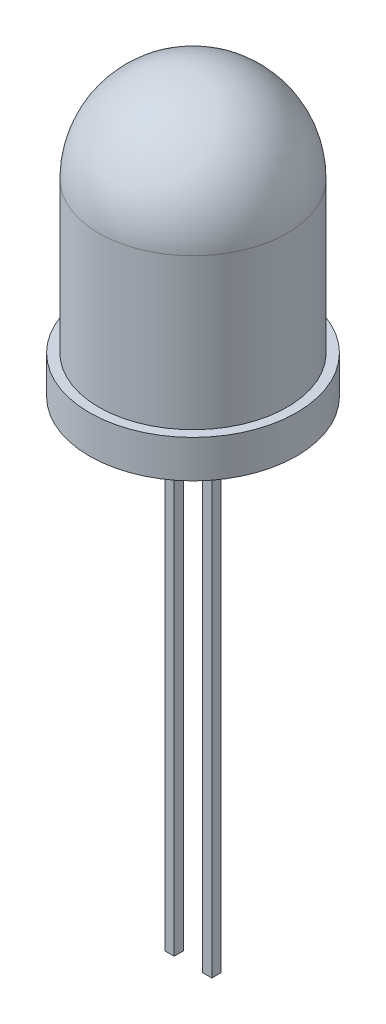
ISO-10303-21;
HEADER;
FILE_DESCRIPTION(('STEP AP214'),'2;1');
FILE_NAME('part.step','',(''),(''),'','','');
FILE_SCHEMA(('AUTOMOTIVE_DESIGN { 1 0 10303 214 1 1 1 1 }'));
ENDSEC;
DATA;
#1=APPLICATION_CONTEXT('core data for automotive mechanical design processes');
#2=APPLICATION_PROTOCOL_DEFINITION('international standard','automotive_design',2000,#1);
#3=PRODUCT_CONTEXT('',#1,'mechanical');
#4=PRODUCT('Part','Part','',(#3));
#5=PRODUCT_RELATED_PRODUCT_CATEGORY('part','',(#4));
#6=PRODUCT_DEFINITION_FORMATION('','',#4);
#7=PRODUCT_DEFINITION_CONTEXT('part definition',#1,'design');
#8=PRODUCT_DEFINITION('design','',#6,#7);
#9=PRODUCT_DEFINITION_SHAPE('','',#8);
#10=(LENGTH_UNIT() NAMED_UNIT(*) SI_UNIT(.MILLI.,.METRE.));
#11=(NAMED_UNIT(*) PLANE_ANGLE_UNIT() SI_UNIT($,.RADIAN.));
#12=(NAMED_UNIT(*) SI_UNIT($,.STERADIAN.) SOLID_ANGLE_UNIT());
#13=UNCERTAINTY_MEASURE_WITH_UNIT(LENGTH_MEASURE(1.E-05),#10,'distance_accuracy_value','');
#14=(GEOMETRIC_REPRESENTATION_CONTEXT(3) GLOBAL_UNCERTAINTY_ASSIGNED_CONTEXT((#13)) GLOBAL_UNIT_ASSIGNED_CONTEXT((#10,
#11,#12)) REPRESENTATION_CONTEXT('',''));
#15=CARTESIAN_POINT('',(0.,0.,0.));
#16=DIRECTION('',(0.,0.,1.));
#17=DIRECTION('',(1.,0.,0.));
#18=AXIS2_PLACEMENT_3D('',#15,#16,#17);
#19=CARTESIAN_POINT('',(0.,0.,0.));
#20=DIRECTION('',(0.,1.,0.));
#21=DIRECTION('',(0.,0.,1.));
#22=AXIS2_PLACEMENT_3D('',#19,#20,#21);
#23=PLANE('',#22);
#24=DIRECTION('',(0.,0.,-1.));
#25=VECTOR('',#24,1.);
#26=CARTESIAN_POINT('',(-1.25,0.,-0.25));
#27=LINE('',#26,#25);
#28=CARTESIAN_POINT('',(-1.25,0.,0.25));
#29=VERTEX_POINT('',#28);
#30=CARTESIAN_POINT('',(-1.25,0.,-0.25));
#31=VERTEX_POINT('',#30);
#32=EDGE_CURVE('E121',#29,#31,#27,.T.);
#33=ORIENTED_EDGE('',*,*,#32,.F.);
#34=DIRECTION('',(-1.,0.,0.));
#35=VECTOR('',#34,1.);
#36=CARTESIAN_POINT('',(-0.75,0.,0.25));
#37=LINE('',#36,#35);
#38=CARTESIAN_POINT('',(-0.75,0.,0.25));
#39=VERTEX_POINT('',#38);
#40=EDGE_CURVE('E134',#39,#29,#37,.T.);
#41=ORIENTED_EDGE('',*,*,#40,.F.);
#42=DIRECTION('',(0.,0.,1.));
#43=VECTOR('',#42,1.);
#44=CARTESIAN_POINT('',(-0.75,0.,-0.25));
#45=LINE('',#44,#43);
#46=CARTESIAN_POINT('',(-0.75,0.,-0.25));
#47=VERTEX_POINT('',#46);
#48=EDGE_CURVE('E143',#47,#39,#45,.T.);
#49=ORIENTED_EDGE('',*,*,#48,.F.);
#50=DIRECTION('',(1.,0.,0.));
#51=VECTOR('',#50,1.);
#52=CARTESIAN_POINT('',(-0.75,0.,-0.25));
#53=LINE('',#52,#51);
#54=EDGE_CURVE('E124',#31,#47,#53,.T.);
#55=ORIENTED_EDGE('',*,*,#54,.F.);
#56=EDGE_LOOP('',(#33,#41,#49,#55));
#57=FACE_BOUND('',#56,.T.);
#58=CARTESIAN_POINT('',(0.,0.,0.));
#59=DIRECTION('',(0.,1.,0.));
#60=DIRECTION('',(0.,0.,1.));
#61=AXIS2_PLACEMENT_3D('',#58,#59,#60);
#62=CIRCLE('',#61,5.5);
#63=CARTESIAN_POINT('',(0.,0.,5.5));
#64=VERTEX_POINT('',#63);
#65=EDGE_CURVE('E37',#64,#64,#62,.T.);
#66=ORIENTED_EDGE('',*,*,#65,.F.);
#67=EDGE_LOOP('',(#66));
#68=FACE_BOUND('',#67,.T.);
#69=DIRECTION('',(0.,0.,1.));
#70=VECTOR('',#69,1.);
#71=CARTESIAN_POINT('',(1.25,0.,0.25));
#72=LINE('',#71,#70);
#73=CARTESIAN_POINT('',(1.25,0.,-0.25));
#74=VERTEX_POINT('',#73);
#75=CARTESIAN_POINT('',(1.25,0.,0.25));
#76=VERTEX_POINT('',#75);
#77=EDGE_CURVE('E120',#74,#76,#72,.T.);
#78=ORIENTED_EDGE('',*,*,#77,.F.);
#79=DIRECTION('',(1.,0.,0.));
#80=VECTOR('',#79,1.);
#81=CARTESIAN_POINT('',(0.75,0.,-0.25));
#82=LINE('',#81,#80);
#83=CARTESIAN_POINT('',(0.75,0.,-0.25));
#84=VERTEX_POINT('',#83);
#85=EDGE_CURVE('E117',#84,#74,#82,.T.);
#86=ORIENTED_EDGE('',*,*,#85,.F.);
#87=DIRECTION('',(0.,0.,-1.));
#88=VECTOR('',#87,1.);
#89=CARTESIAN_POINT('',(0.75,0.,0.25));
#90=LINE('',#89,#88);
#91=CARTESIAN_POINT('',(0.75,0.,0.25));
#92=VERTEX_POINT('',#91);
#93=EDGE_CURVE('E55',#92,#84,#90,.T.);
#94=ORIENTED_EDGE('',*,*,#93,.F.);
#95=DIRECTION('',(-1.,0.,0.));
#96=VECTOR('',#95,1.);
#97=CARTESIAN_POINT('',(0.75,0.,0.25));
#98=LINE('',#97,#96);
#99=EDGE_CURVE('E50',#76,#92,#98,.T.);
#100=ORIENTED_EDGE('',*,*,#99,.F.);
#101=EDGE_LOOP('',(#78,#86,#94,#100));
#102=FACE_BOUND('',#101,.T.);
#103=ADVANCED_FACE('F33',(#57,#68,#102),#23,.F.);
#104=CARTESIAN_POINT('',(0.,2.,0.));
#105=DIRECTION('',(0.,-1.,0.));
#106=DIRECTION('',(0.,0.,-1.));
#107=AXIS2_PLACEMENT_3D('',#104,#105,#106);
#108=CYLINDRICAL_SURFACE('',#107,5.5);
#109=CARTESIAN_POINT('',(0.,2.,0.));
#110=DIRECTION('',(0.,1.,0.));
#111=DIRECTION('',(0.,0.,1.));
#112=AXIS2_PLACEMENT_3D('',#109,#110,#111);
#113=CIRCLE('',#112,5.5);
#114=CARTESIAN_POINT('',(0.,2.,5.5));
#115=VERTEX_POINT('',#114);
#116=EDGE_CURVE('E42',#115,#115,#113,.T.);
#117=ORIENTED_EDGE('',*,*,#116,.F.);
#118=EDGE_LOOP('',(#117));
#119=FACE_BOUND('',#118,.T.);
#120=ORIENTED_EDGE('',*,*,#65,.T.);
#121=EDGE_LOOP('',(#120));
#122=FACE_BOUND('',#121,.T.);
#123=ADVANCED_FACE('F35',(#119,#122),#108,.T.);
#124=CARTESIAN_POINT('',(0.,2.,0.));
#125=DIRECTION('',(0.,1.,0.));
#126=DIRECTION('',(0.,0.,1.));
#127=AXIS2_PLACEMENT_3D('',#124,#125,#126);
#128=PLANE('',#127);
#129=CARTESIAN_POINT('',(0.,2.,0.));
#130=DIRECTION('',(0.,1.,0.));
#131=DIRECTION('',(0.,0.,1.));
#132=AXIS2_PLACEMENT_3D('',#129,#130,#131);
#133=CIRCLE('',#132,5.);
#134=CARTESIAN_POINT('',(0.,2.,5.));
#135=VERTEX_POINT('',#134);
#136=EDGE_CURVE('E11',#135,#135,#133,.T.);
#137=ORIENTED_EDGE('',*,*,#136,.F.);
#138=EDGE_LOOP('',(#137));
#139=FACE_BOUND('',#138,.T.);
#140=ORIENTED_EDGE('',*,*,#116,.T.);
#141=EDGE_LOOP('',(#140));
#142=FACE_BOUND('',#141,.T.);
#143=ADVANCED_FACE('F224',(#139,#142),#128,.T.);
#144=CARTESIAN_POINT('',(0.,10.,0.));
#145=DIRECTION('',(0.,-1.,0.));
#146=DIRECTION('',(0.,0.,-1.));
#147=AXIS2_PLACEMENT_3D('',#144,#145,#146);
#148=CYLINDRICAL_SURFACE('',#147,5.);
#149=CARTESIAN_POINT('',(0.,10.,0.));
#150=DIRECTION('',(0.,1.,0.));
#151=DIRECTION('',(0.,0.,1.));
#152=AXIS2_PLACEMENT_3D('',#149,#150,#151);
#153=CIRCLE('',#152,5.);
#154=CARTESIAN_POINT('',(0.,10.,5.));
#155=VERTEX_POINT('',#154);
#156=EDGE_CURVE('E159',#155,#155,#153,.T.);
#157=ORIENTED_EDGE('',*,*,#156,.F.);
#158=EDGE_LOOP('',(#157));
#159=FACE_BOUND('',#158,.T.);
#160=ORIENTED_EDGE('',*,*,#136,.T.);
#161=EDGE_LOOP('',(#160));
#162=FACE_BOUND('',#161,.T.);
#163=ADVANCED_FACE('F220',(#159,#162),#148,.T.);
#164=CARTESIAN_POINT('',(0.,10.,0.));
#165=DIRECTION('',(0.,0.,-1.));
#166=DIRECTION('',(-1.,0.,0.));
#167=AXIS2_PLACEMENT_3D('',#164,#165,#166);
#168=SPHERICAL_SURFACE('',#167,5.);
#169=CARTESIAN_POINT('',(0.,10.,0.));
#170=DIRECTION('',(0.,1.,0.));
#171=DIRECTION('',(0.,0.,1.));
#172=AXIS2_PLACEMENT_3D('',#169,#170,#171);
#173=SPHERICAL_SURFACE('',#172,5.);
#174=ORIENTED_EDGE('',*,*,#156,.T.);
#175=EDGE_LOOP('',(#174));
#176=FACE_BOUND('',#175,.T.);
#177=ADVANCED_FACE('F216',(#176),#173,.T.);
#178=CARTESIAN_POINT('',(-1.25,-26.,-0.25));
#179=DIRECTION('',(1.,0.,0.));
#180=DIRECTION('',(0.,0.,-1.));
#181=AXIS2_PLACEMENT_3D('',#178,#179,#180);
#182=PLANE('',#181);
#183=ORIENTED_EDGE('',*,*,#32,.T.);
#184=DIRECTION('',(0.,1.,0.));
#185=VECTOR('',#184,1.);
#186=CARTESIAN_POINT('',(-1.25,-26.,-0.25));
#187=LINE('',#186,#185);
#188=CARTESIAN_POINT('',(-1.25,-26.,-0.25));
#189=VERTEX_POINT('',#188);
#190=EDGE_CURVE('E156',#189,#31,#187,.T.);
#191=ORIENTED_EDGE('',*,*,#190,.F.);
#192=DIRECTION('',(0.,0.,-1.));
#193=VECTOR('',#192,1.);
#194=CARTESIAN_POINT('',(-1.25,-26.,-0.25));
#195=LINE('',#194,#193);
#196=CARTESIAN_POINT('',(-1.25,-26.,0.25));
#197=VERTEX_POINT('',#196);
#198=EDGE_CURVE('E130',#197,#189,#195,.T.);
#199=ORIENTED_EDGE('',*,*,#198,.F.);
#200=DIRECTION('',(0.,1.,0.));
#201=VECTOR('',#200,1.);
#202=CARTESIAN_POINT('',(-1.25,-26.,0.25));
#203=LINE('',#202,#201);
#204=EDGE_CURVE('E139',#197,#29,#203,.T.);
#205=ORIENTED_EDGE('',*,*,#204,.T.);
#206=EDGE_LOOP('',(#183,#191,#199,#205));
#207=FACE_BOUND('',#206,.T.);
#208=ADVANCED_FACE('F212',(#207),#182,.F.);
#209=CARTESIAN_POINT('',(-0.75,-26.,-0.25));
#210=DIRECTION('',(0.,0.,1.));
#211=DIRECTION('',(1.,0.,0.));
#212=AXIS2_PLACEMENT_3D('',#209,#210,#211);
#213=PLANE('',#212);
#214=ORIENTED_EDGE('',*,*,#54,.T.);
#215=DIRECTION('',(0.,1.,0.));
#216=VECTOR('',#215,1.);
#217=CARTESIAN_POINT('',(-0.75,-26.,-0.25));
#218=LINE('',#217,#216);
#219=CARTESIAN_POINT('',(-0.75,-26.,-0.25));
#220=VERTEX_POINT('',#219);
#221=EDGE_CURVE('E153',#220,#47,#218,.T.);
#222=ORIENTED_EDGE('',*,*,#221,.F.);
#223=DIRECTION('',(1.,0.,0.));
#224=VECTOR('',#223,1.);
#225=CARTESIAN_POINT('',(-0.75,-26.,-0.25));
#226=LINE('',#225,#224);
#227=EDGE_CURVE('E133',#189,#220,#226,.T.);
#228=ORIENTED_EDGE('',*,*,#227,.F.);
#229=ORIENTED_EDGE('',*,*,#190,.T.);
#230=EDGE_LOOP('',(#214,#222,#228,#229));
#231=FACE_BOUND('',#230,.T.);
#232=ADVANCED_FACE('F208',(#231),#213,.F.);
#233=CARTESIAN_POINT('',(-0.75,-26.,-0.25));
#234=DIRECTION('',(-1.,0.,0.));
#235=DIRECTION('',(0.,0.,1.));
#236=AXIS2_PLACEMENT_3D('',#233,#234,#235);
#237=PLANE('',#236);
#238=ORIENTED_EDGE('',*,*,#48,.T.);
#239=DIRECTION('',(0.,1.,0.));
#240=VECTOR('',#239,1.);
#241=CARTESIAN_POINT('',(-0.75,-26.,0.25));
#242=LINE('',#241,#240);
#243=CARTESIAN_POINT('',(-0.75,-26.,0.25));
#244=VERTEX_POINT('',#243);
#245=EDGE_CURVE('E150',#244,#39,#242,.T.);
#246=ORIENTED_EDGE('',*,*,#245,.F.);
#247=DIRECTION('',(0.,0.,1.));
#248=VECTOR('',#247,1.);
#249=CARTESIAN_POINT('',(-0.75,-26.,-0.25));
#250=LINE('',#249,#248);
#251=EDGE_CURVE('E136',#220,#244,#250,.T.);
#252=ORIENTED_EDGE('',*,*,#251,.F.);
#253=ORIENTED_EDGE('',*,*,#221,.T.);
#254=EDGE_LOOP('',(#238,#246,#252,#253));
#255=FACE_BOUND('',#254,.T.);
#256=ADVANCED_FACE('F204',(#255),#237,.F.);
#257=CARTESIAN_POINT('',(-0.75,-26.,0.25));
#258=DIRECTION('',(0.,0.,-1.));
#259=DIRECTION('',(-1.,0.,0.));
#260=AXIS2_PLACEMENT_3D('',#257,#258,#259);
#261=PLANE('',#260);
#262=ORIENTED_EDGE('',*,*,#40,.T.);
#263=ORIENTED_EDGE('',*,*,#204,.F.);
#264=DIRECTION('',(-1.,0.,0.));
#265=VECTOR('',#264,1.);
#266=CARTESIAN_POINT('',(-0.75,-26.,0.25));
#267=LINE('',#266,#265);
#268=EDGE_CURVE('E138',#244,#197,#267,.T.);
#269=ORIENTED_EDGE('',*,*,#268,.F.);
#270=ORIENTED_EDGE('',*,*,#245,.T.);
#271=EDGE_LOOP('',(#262,#263,#269,#270));
#272=FACE_BOUND('',#271,.T.);
#273=ADVANCED_FACE('F200',(#272),#261,.F.);
#274=CARTESIAN_POINT('',(0.,-26.,0.));
#275=DIRECTION('',(0.,-1.,0.));
#276=DIRECTION('',(0.,0.,-1.));
#277=AXIS2_PLACEMENT_3D('',#274,#275,#276);
#278=PLANE('',#277);
#279=ORIENTED_EDGE('',*,*,#198,.T.);
#280=ORIENTED_EDGE('',*,*,#227,.T.);
#281=ORIENTED_EDGE('',*,*,#251,.T.);
#282=ORIENTED_EDGE('',*,*,#268,.T.);
#283=EDGE_LOOP('',(#279,#280,#281,#282));
#284=FACE_BOUND('',#283,.T.);
#285=ADVANCED_FACE('F197',(#284),#278,.T.);
#286=CARTESIAN_POINT('',(1.25,-26.,0.25));
#287=DIRECTION('',(-1.,0.,0.));
#288=DIRECTION('',(0.,0.,1.));
#289=AXIS2_PLACEMENT_3D('',#286,#287,#288);
#290=PLANE('',#289);
#291=ORIENTED_EDGE('',*,*,#77,.T.);
#292=DIRECTION('',(0.,1.,0.));
#293=VECTOR('',#292,1.);
#294=CARTESIAN_POINT('',(1.25,-26.,0.25));
#295=LINE('',#294,#293);
#296=CARTESIAN_POINT('',(1.25,-26.,0.25));
#297=VERTEX_POINT('',#296);
#298=EDGE_CURVE('E101',#297,#76,#295,.T.);
#299=ORIENTED_EDGE('',*,*,#298,.F.);
#300=DIRECTION('',(0.,0.,1.));
#301=VECTOR('',#300,1.);
#302=CARTESIAN_POINT('',(1.25,-26.,0.25));
#303=LINE('',#302,#301);
#304=CARTESIAN_POINT('',(1.25,-26.,-0.25));
#305=VERTEX_POINT('',#304);
#306=EDGE_CURVE('E108',#305,#297,#303,.T.);
#307=ORIENTED_EDGE('',*,*,#306,.F.);
#308=DIRECTION('',(0.,1.,0.));
#309=VECTOR('',#308,1.);
#310=CARTESIAN_POINT('',(1.25,-26.,-0.25));
#311=LINE('',#310,#309);
#312=EDGE_CURVE('E175',#305,#74,#311,.T.);
#313=ORIENTED_EDGE('',*,*,#312,.T.);
#314=EDGE_LOOP('',(#291,#299,#307,#313));
#315=FACE_BOUND('',#314,.T.);
#316=ADVANCED_FACE('F119',(#315),#290,.F.);
#317=CARTESIAN_POINT('',(0.75,-26.,0.25));
#318=DIRECTION('',(0.,0.,-1.));
#319=DIRECTION('',(-1.,0.,0.));
#320=AXIS2_PLACEMENT_3D('',#317,#318,#319);
#321=PLANE('',#320);
#322=ORIENTED_EDGE('',*,*,#99,.T.);
#323=DIRECTION('',(0.,1.,0.));
#324=VECTOR('',#323,1.);
#325=CARTESIAN_POINT('',(0.75,-26.,0.25));
#326=LINE('',#325,#324);
#327=CARTESIAN_POINT('',(0.75,-26.,0.25));
#328=VERTEX_POINT('',#327);
#329=EDGE_CURVE('E104',#328,#92,#326,.T.);
#330=ORIENTED_EDGE('',*,*,#329,.F.);
#331=DIRECTION('',(-1.,0.,0.));
#332=VECTOR('',#331,1.);
#333=CARTESIAN_POINT('',(0.75,-26.,0.25));
#334=LINE('',#333,#332);
#335=EDGE_CURVE('E97',#297,#328,#334,.T.);
#336=ORIENTED_EDGE('',*,*,#335,.F.);
#337=ORIENTED_EDGE('',*,*,#298,.T.);
#338=EDGE_LOOP('',(#322,#330,#336,#337));
#339=FACE_BOUND('',#338,.T.);
#340=ADVANCED_FACE('F99',(#339),#321,.F.);
#341=CARTESIAN_POINT('',(0.75,-26.,0.25));
#342=DIRECTION('',(1.,0.,0.));
#343=DIRECTION('',(0.,0.,-1.));
#344=AXIS2_PLACEMENT_3D('',#341,#342,#343);
#345=PLANE('',#344);
#346=ORIENTED_EDGE('',*,*,#93,.T.);
#347=DIRECTION('',(0.,1.,0.));
#348=VECTOR('',#347,1.);
#349=CARTESIAN_POINT('',(0.75,-26.,-0.25));
#350=LINE('',#349,#348);
#351=CARTESIAN_POINT('',(0.75,-26.,-0.25));
#352=VERTEX_POINT('',#351);
#353=EDGE_CURVE('E126',#352,#84,#350,.T.);
#354=ORIENTED_EDGE('',*,*,#353,.F.);
#355=DIRECTION('',(0.,0.,-1.));
#356=VECTOR('',#355,1.);
#357=CARTESIAN_POINT('',(0.75,-26.,0.25));
#358=LINE('',#357,#356);
#359=EDGE_CURVE('E107',#328,#352,#358,.T.);
#360=ORIENTED_EDGE('',*,*,#359,.F.);
#361=ORIENTED_EDGE('',*,*,#329,.T.);
#362=EDGE_LOOP('',(#346,#354,#360,#361));
#363=FACE_BOUND('',#362,.T.);
#364=ADVANCED_FACE('F184',(#363),#345,.F.);
#365=CARTESIAN_POINT('',(0.75,-26.,-0.25));
#366=DIRECTION('',(0.,0.,1.));
#367=DIRECTION('',(1.,0.,0.));
#368=AXIS2_PLACEMENT_3D('',#365,#366,#367);
#369=PLANE('',#368);
#370=ORIENTED_EDGE('',*,*,#85,.T.);
#371=ORIENTED_EDGE('',*,*,#312,.F.);
#372=DIRECTION('',(1.,0.,0.));
#373=VECTOR('',#372,1.);
#374=CARTESIAN_POINT('',(0.75,-26.,-0.25));
#375=LINE('',#374,#373);
#376=EDGE_CURVE('E113',#352,#305,#375,.T.);
#377=ORIENTED_EDGE('',*,*,#376,.F.);
#378=ORIENTED_EDGE('',*,*,#353,.T.);
#379=EDGE_LOOP('',(#370,#371,#377,#378));
#380=FACE_BOUND('',#379,.T.);
#381=ADVANCED_FACE('F174',(#380),#369,.F.);
#382=CARTESIAN_POINT('',(0.,-26.,0.));
#383=DIRECTION('',(0.,-1.,0.));
#384=DIRECTION('',(0.,0.,-1.));
#385=AXIS2_PLACEMENT_3D('',#382,#383,#384);
#386=PLANE('',#385);
#387=ORIENTED_EDGE('',*,*,#306,.T.);
#388=ORIENTED_EDGE('',*,*,#335,.T.);
#389=ORIENTED_EDGE('',*,*,#359,.T.);
#390=ORIENTED_EDGE('',*,*,#376,.T.);
#391=EDGE_LOOP('',(#387,#388,#389,#390));
#392=FACE_BOUND('',#391,.T.);
#393=ADVANCED_FACE('F111',(#392),#386,.T.);
#394=CLOSED_SHELL('',(#103,#123,#143,#163,#177,#208,#232,#256,#273,#285,#316,#340,#364,#381,#393));
#395=MANIFOLD_SOLID_BREP('B2',#394);
#396=ADVANCED_BREP_SHAPE_REPRESENTATION('',(#18,#395),#14);
#397=SHAPE_DEFINITION_REPRESENTATION(#9,#396);
ENDSEC;
END-ISO-10303-21;
